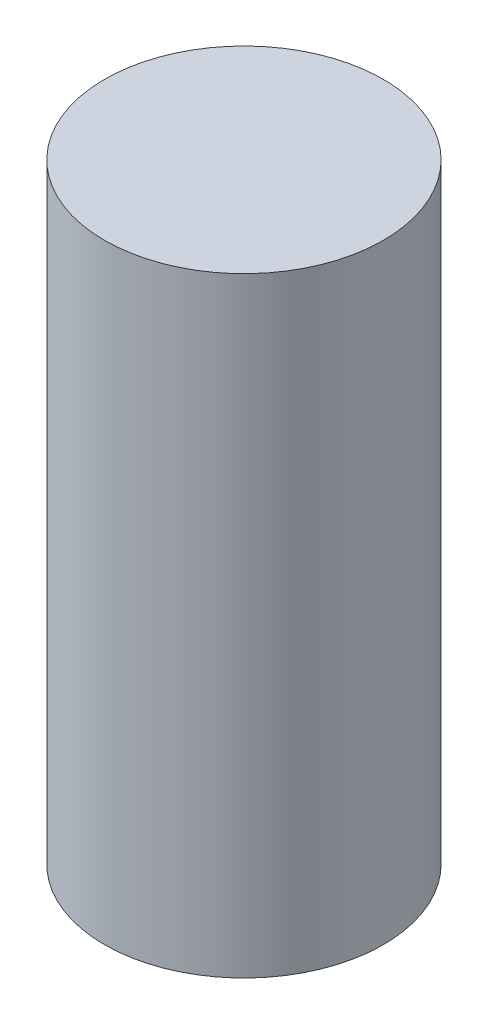
ISO-10303-21;
HEADER;
FILE_DESCRIPTION(('STEP AP214'),'2;1');
FILE_NAME('part.step','',(''),(''),'','','');
FILE_SCHEMA(('AUTOMOTIVE_DESIGN { 1 0 10303 214 1 1 1 1 }'));
ENDSEC;
DATA;
#1=APPLICATION_CONTEXT('core data for automotive mechanical design processes');
#2=APPLICATION_PROTOCOL_DEFINITION('international standard','automotive_design',2000,#1);
#3=PRODUCT_CONTEXT('',#1,'mechanical');
#4=PRODUCT('Part','Part','',(#3));
#5=PRODUCT_RELATED_PRODUCT_CATEGORY('part','',(#4));
#6=PRODUCT_DEFINITION_FORMATION('','',#4);
#7=PRODUCT_DEFINITION_CONTEXT('part definition',#1,'design');
#8=PRODUCT_DEFINITION('design','',#6,#7);
#9=PRODUCT_DEFINITION_SHAPE('','',#8);
#10=(LENGTH_UNIT() NAMED_UNIT(*) SI_UNIT(.MILLI.,.METRE.));
#11=(NAMED_UNIT(*) PLANE_ANGLE_UNIT() SI_UNIT($,.RADIAN.));
#12=(NAMED_UNIT(*) SI_UNIT($,.STERADIAN.) SOLID_ANGLE_UNIT());
#13=UNCERTAINTY_MEASURE_WITH_UNIT(LENGTH_MEASURE(1.E-05),#10,'distance_accuracy_value','');
#14=(GEOMETRIC_REPRESENTATION_CONTEXT(3) GLOBAL_UNCERTAINTY_ASSIGNED_CONTEXT((#13)) GLOBAL_UNIT_ASSIGNED_CONTEXT((#10,
#11,#12)) REPRESENTATION_CONTEXT('',''));
#15=CARTESIAN_POINT('',(0.,0.,0.));
#16=DIRECTION('',(0.,0.,1.));
#17=DIRECTION('',(1.,0.,0.));
#18=AXIS2_PLACEMENT_3D('',#15,#16,#17);
#19=CARTESIAN_POINT('',(0.,35.,0.));
#20=DIRECTION('',(0.,-1.,0.));
#21=DIRECTION('',(0.,0.,-1.));
#22=AXIS2_PLACEMENT_3D('',#19,#20,#21);
#23=CYLINDRICAL_SURFACE('',#22,8.);
#24=CARTESIAN_POINT('',(0.,35.,0.));
#25=DIRECTION('',(0.,1.,0.));
#26=DIRECTION('',(0.,0.,1.));
#27=AXIS2_PLACEMENT_3D('',#24,#25,#26);
#28=CIRCLE('',#27,8.);
#29=CARTESIAN_POINT('',(0.,35.,8.));
#30=VERTEX_POINT('',#29);
#31=EDGE_CURVE('E10',#30,#30,#28,.T.);
#32=ORIENTED_EDGE('',*,*,#31,.F.);
#33=EDGE_LOOP('',(#32));
#34=FACE_BOUND('',#33,.T.);
#35=CARTESIAN_POINT('',(0.,0.,0.));
#36=DIRECTION('',(0.,1.,0.));
#37=DIRECTION('',(0.,0.,1.));
#38=AXIS2_PLACEMENT_3D('',#35,#36,#37);
#39=CIRCLE('',#38,8.);
#40=CARTESIAN_POINT('',(0.,0.,8.));
#41=VERTEX_POINT('',#40);
#42=EDGE_CURVE('E36',#41,#41,#39,.T.);
#43=ORIENTED_EDGE('',*,*,#42,.T.);
#44=EDGE_LOOP('',(#43));
#45=FACE_BOUND('',#44,.T.);
#46=ADVANCED_FACE('F33',(#34,#45),#23,.T.);
#47=CARTESIAN_POINT('',(0.,35.,0.));
#48=DIRECTION('',(0.,1.,0.));
#49=DIRECTION('',(0.,0.,1.));
#50=AXIS2_PLACEMENT_3D('',#47,#48,#49);
#51=PLANE('',#50);
#52=ORIENTED_EDGE('',*,*,#31,.T.);
#53=EDGE_LOOP('',(#52));
#54=FACE_BOUND('',#53,.T.);
#55=ADVANCED_FACE('F48',(#54),#51,.T.);
#56=CARTESIAN_POINT('',(0.,0.,0.));
#57=DIRECTION('',(0.,1.,0.));
#58=DIRECTION('',(0.,0.,1.));
#59=AXIS2_PLACEMENT_3D('',#56,#57,#58);
#60=PLANE('',#59);
#61=ORIENTED_EDGE('',*,*,#42,.F.);
#62=EDGE_LOOP('',(#61));
#63=FACE_BOUND('',#62,.T.);
#64=ADVANCED_FACE('F46',(#63),#60,.F.);
#65=CLOSED_SHELL('',(#46,#55,#64));
#66=MANIFOLD_SOLID_BREP('B2',#65);
#67=ADVANCED_BREP_SHAPE_REPRESENTATION('',(#18,#66),#14);
#68=SHAPE_DEFINITION_REPRESENTATION(#9,#67);
ENDSEC;
END-ISO-10303-21;
